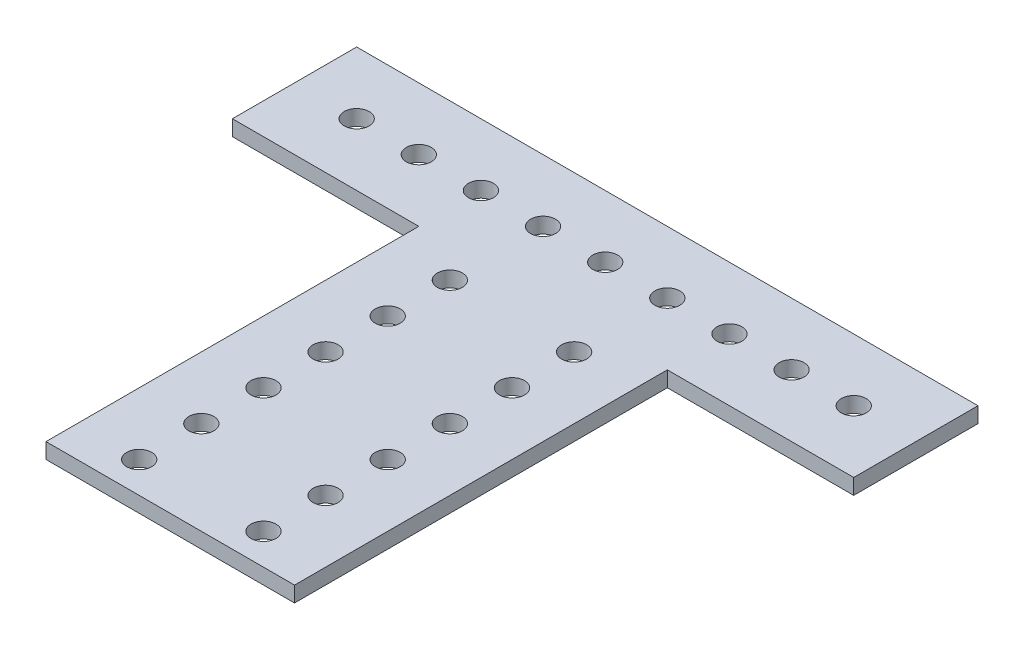
ISO-10303-21;
HEADER;
FILE_DESCRIPTION(('STEP AP214'),'2;1');
FILE_NAME('part.step','',(''),(''),'','','');
FILE_SCHEMA(('AUTOMOTIVE_DESIGN { 1 0 10303 214 1 1 1 1 }'));
ENDSEC;
DATA;
#1=APPLICATION_CONTEXT('core data for automotive mechanical design processes');
#2=APPLICATION_PROTOCOL_DEFINITION('international standard','automotive_design',2000,#1);
#3=PRODUCT_CONTEXT('',#1,'mechanical');
#4=PRODUCT('Part','Part','',(#3));
#5=PRODUCT_RELATED_PRODUCT_CATEGORY('part','',(#4));
#6=PRODUCT_DEFINITION_FORMATION('','',#4);
#7=PRODUCT_DEFINITION_CONTEXT('part definition',#1,'design');
#8=PRODUCT_DEFINITION('design','',#6,#7);
#9=PRODUCT_DEFINITION_SHAPE('','',#8);
#10=(LENGTH_UNIT() NAMED_UNIT(*) SI_UNIT(.MILLI.,.METRE.));
#11=(NAMED_UNIT(*) PLANE_ANGLE_UNIT() SI_UNIT($,.RADIAN.));
#12=(NAMED_UNIT(*) SI_UNIT($,.STERADIAN.) SOLID_ANGLE_UNIT());
#13=UNCERTAINTY_MEASURE_WITH_UNIT(LENGTH_MEASURE(1.E-05),#10,'distance_accuracy_value','');
#14=(GEOMETRIC_REPRESENTATION_CONTEXT(3) GLOBAL_UNCERTAINTY_ASSIGNED_CONTEXT((#13)) GLOBAL_UNIT_ASSIGNED_CONTEXT((#10,
#11,#12)) REPRESENTATION_CONTEXT('',''));
#15=CARTESIAN_POINT('',(0.,0.,0.));
#16=DIRECTION('',(0.,0.,1.));
#17=DIRECTION('',(1.,0.,0.));
#18=AXIS2_PLACEMENT_3D('',#15,#16,#17);
#19=CARTESIAN_POINT('',(0.,3.175,-76.2));
#20=DIRECTION('',(1.,0.,0.));
#21=DIRECTION('',(0.,0.,-1.));
#22=AXIS2_PLACEMENT_3D('',#19,#20,#21);
#23=PLANE('',#22);
#24=DIRECTION('',(0.,0.,1.));
#25=VECTOR('',#24,1.);
#26=CARTESIAN_POINT('',(0.,0.,-76.2));
#27=LINE('',#26,#25);
#28=CARTESIAN_POINT('',(0.,0.,-76.2));
#29=VERTEX_POINT('',#28);
#30=CARTESIAN_POINT('',(0.,0.,0.));
#31=VERTEX_POINT('',#30);
#32=EDGE_CURVE('E139',#29,#31,#27,.T.);
#33=ORIENTED_EDGE('',*,*,#32,.T.);
#34=DIRECTION('',(0.,-1.,0.));
#35=VECTOR('',#34,1.);
#36=CARTESIAN_POINT('',(0.,3.175,0.));
#37=LINE('',#36,#35);
#38=CARTESIAN_POINT('',(0.,3.175,0.));
#39=VERTEX_POINT('',#38);
#40=EDGE_CURVE('E11',#39,#31,#37,.T.);
#41=ORIENTED_EDGE('',*,*,#40,.F.);
#42=DIRECTION('',(0.,0.,1.));
#43=VECTOR('',#42,1.);
#44=CARTESIAN_POINT('',(0.,3.175,-76.2));
#45=LINE('',#44,#43);
#46=CARTESIAN_POINT('',(0.,3.175,-76.2));
#47=VERTEX_POINT('',#46);
#48=EDGE_CURVE('E162',#47,#39,#45,.T.);
#49=ORIENTED_EDGE('',*,*,#48,.F.);
#50=DIRECTION('',(0.,-1.,0.));
#51=VECTOR('',#50,1.);
#52=CARTESIAN_POINT('',(0.,3.175,-76.2));
#53=LINE('',#52,#51);
#54=EDGE_CURVE('E135',#47,#29,#53,.T.);
#55=ORIENTED_EDGE('',*,*,#54,.T.);
#56=EDGE_LOOP('',(#33,#41,#49,#55));
#57=FACE_BOUND('',#56,.T.);
#58=ADVANCED_FACE('F38',(#57),#23,.F.);
#59=CARTESIAN_POINT('',(0.,3.175,0.));
#60=DIRECTION('',(0.,0.,-1.));
#61=DIRECTION('',(-1.,0.,0.));
#62=AXIS2_PLACEMENT_3D('',#59,#60,#61);
#63=PLANE('',#62);
#64=DIRECTION('',(1.,0.,0.));
#65=VECTOR('',#64,1.);
#66=CARTESIAN_POINT('',(0.,0.,0.));
#67=LINE('',#66,#65);
#68=CARTESIAN_POINT('',(50.8,0.,0.));
#69=VERTEX_POINT('',#68);
#70=EDGE_CURVE('E143',#31,#69,#67,.T.);
#71=ORIENTED_EDGE('',*,*,#70,.T.);
#72=DIRECTION('',(0.,-1.,0.));
#73=VECTOR('',#72,1.);
#74=CARTESIAN_POINT('',(50.8,3.175,0.));
#75=LINE('',#74,#73);
#76=CARTESIAN_POINT('',(50.8,3.175,0.));
#77=VERTEX_POINT('',#76);
#78=EDGE_CURVE('E47',#77,#69,#75,.T.);
#79=ORIENTED_EDGE('',*,*,#78,.F.);
#80=DIRECTION('',(1.,0.,0.));
#81=VECTOR('',#80,1.);
#82=CARTESIAN_POINT('',(0.,3.175,0.));
#83=LINE('',#82,#81);
#84=EDGE_CURVE('E98',#39,#77,#83,.T.);
#85=ORIENTED_EDGE('',*,*,#84,.F.);
#86=ORIENTED_EDGE('',*,*,#40,.T.);
#87=EDGE_LOOP('',(#71,#79,#85,#86));
#88=FACE_BOUND('',#87,.T.);
#89=ADVANCED_FACE('F444',(#88),#63,.F.);
#90=CARTESIAN_POINT('',(50.8,3.175,0.));
#91=DIRECTION('',(-1.,0.,0.));
#92=DIRECTION('',(0.,0.,1.));
#93=AXIS2_PLACEMENT_3D('',#90,#91,#92);
#94=PLANE('',#93);
#95=DIRECTION('',(0.,0.,-1.));
#96=VECTOR('',#95,1.);
#97=CARTESIAN_POINT('',(50.8,0.,0.));
#98=LINE('',#97,#96);
#99=CARTESIAN_POINT('',(50.8,0.,-76.2));
#100=VERTEX_POINT('',#99);
#101=EDGE_CURVE('E147',#69,#100,#98,.T.);
#102=ORIENTED_EDGE('',*,*,#101,.T.);
#103=DIRECTION('',(0.,-1.,0.));
#104=VECTOR('',#103,1.);
#105=CARTESIAN_POINT('',(50.8,3.175,-76.2));
#106=LINE('',#105,#104);
#107=CARTESIAN_POINT('',(50.8,3.175,-76.2));
#108=VERTEX_POINT('',#107);
#109=EDGE_CURVE('E173',#108,#100,#106,.T.);
#110=ORIENTED_EDGE('',*,*,#109,.F.);
#111=DIRECTION('',(0.,0.,-1.));
#112=VECTOR('',#111,1.);
#113=CARTESIAN_POINT('',(50.8,3.175,0.));
#114=LINE('',#113,#112);
#115=EDGE_CURVE('E183',#77,#108,#114,.T.);
#116=ORIENTED_EDGE('',*,*,#115,.F.);
#117=ORIENTED_EDGE('',*,*,#78,.T.);
#118=EDGE_LOOP('',(#102,#110,#116,#117));
#119=FACE_BOUND('',#118,.T.);
#120=ADVANCED_FACE('F181',(#119),#94,.F.);
#121=CARTESIAN_POINT('',(50.8,3.175,-76.2));
#122=DIRECTION('',(0.,0.,-1.));
#123=DIRECTION('',(-1.,0.,0.));
#124=AXIS2_PLACEMENT_3D('',#121,#122,#123);
#125=PLANE('',#124);
#126=DIRECTION('',(1.,0.,0.));
#127=VECTOR('',#126,1.);
#128=CARTESIAN_POINT('',(50.8,0.,-76.2));
#129=LINE('',#128,#127);
#130=CARTESIAN_POINT('',(88.9,0.,-76.2));
#131=VERTEX_POINT('',#130);
#132=EDGE_CURVE('E150',#100,#131,#129,.T.);
#133=ORIENTED_EDGE('',*,*,#132,.T.);
#134=DIRECTION('',(0.,-1.,0.));
#135=VECTOR('',#134,1.);
#136=CARTESIAN_POINT('',(88.9,3.175,-76.2));
#137=LINE('',#136,#135);
#138=CARTESIAN_POINT('',(88.9,3.175,-76.2));
#139=VERTEX_POINT('',#138);
#140=EDGE_CURVE('E169',#139,#131,#137,.T.);
#141=ORIENTED_EDGE('',*,*,#140,.F.);
#142=DIRECTION('',(1.,0.,0.));
#143=VECTOR('',#142,1.);
#144=CARTESIAN_POINT('',(50.8,3.175,-76.2));
#145=LINE('',#144,#143);
#146=EDGE_CURVE('E196',#108,#139,#145,.T.);
#147=ORIENTED_EDGE('',*,*,#146,.F.);
#148=ORIENTED_EDGE('',*,*,#109,.T.);
#149=EDGE_LOOP('',(#133,#141,#147,#148));
#150=FACE_BOUND('',#149,.T.);
#151=ADVANCED_FACE('F191',(#150),#125,.F.);
#152=CARTESIAN_POINT('',(88.9,3.175,-76.2));
#153=DIRECTION('',(-1.,0.,0.));
#154=DIRECTION('',(0.,0.,1.));
#155=AXIS2_PLACEMENT_3D('',#152,#153,#154);
#156=PLANE('',#155);
#157=DIRECTION('',(0.,0.,-1.));
#158=VECTOR('',#157,1.);
#159=CARTESIAN_POINT('',(88.9,0.,-76.2));
#160=LINE('',#159,#158);
#161=CARTESIAN_POINT('',(88.9,0.,-101.6));
#162=VERTEX_POINT('',#161);
#163=EDGE_CURVE('E153',#131,#162,#160,.T.);
#164=ORIENTED_EDGE('',*,*,#163,.T.);
#165=DIRECTION('',(0.,-1.,0.));
#166=VECTOR('',#165,1.);
#167=CARTESIAN_POINT('',(88.9,3.175,-101.6));
#168=LINE('',#167,#166);
#169=CARTESIAN_POINT('',(88.9,3.175,-101.6));
#170=VERTEX_POINT('',#169);
#171=EDGE_CURVE('E128',#170,#162,#168,.T.);
#172=ORIENTED_EDGE('',*,*,#171,.F.);
#173=DIRECTION('',(0.,0.,-1.));
#174=VECTOR('',#173,1.);
#175=CARTESIAN_POINT('',(88.9,3.175,-76.2));
#176=LINE('',#175,#174);
#177=EDGE_CURVE('E117',#139,#170,#176,.T.);
#178=ORIENTED_EDGE('',*,*,#177,.F.);
#179=ORIENTED_EDGE('',*,*,#140,.T.);
#180=EDGE_LOOP('',(#164,#172,#178,#179));
#181=FACE_BOUND('',#180,.T.);
#182=ADVANCED_FACE('F194',(#181),#156,.F.);
#183=CARTESIAN_POINT('',(88.9,3.175,-101.6));
#184=DIRECTION('',(0.,0.,1.));
#185=DIRECTION('',(1.,0.,0.));
#186=AXIS2_PLACEMENT_3D('',#183,#184,#185);
#187=PLANE('',#186);
#188=DIRECTION('',(-1.,0.,0.));
#189=VECTOR('',#188,1.);
#190=CARTESIAN_POINT('',(88.9,0.,-101.6));
#191=LINE('',#190,#189);
#192=CARTESIAN_POINT('',(-38.1,0.,-101.6));
#193=VERTEX_POINT('',#192);
#194=EDGE_CURVE('E126',#162,#193,#191,.T.);
#195=ORIENTED_EDGE('',*,*,#194,.T.);
#196=DIRECTION('',(0.,-1.,0.));
#197=VECTOR('',#196,1.);
#198=CARTESIAN_POINT('',(-38.1,3.175,-101.6));
#199=LINE('',#198,#197);
#200=CARTESIAN_POINT('',(-38.1,3.175,-101.6));
#201=VERTEX_POINT('',#200);
#202=EDGE_CURVE('E123',#201,#193,#199,.T.);
#203=ORIENTED_EDGE('',*,*,#202,.F.);
#204=DIRECTION('',(-1.,0.,0.));
#205=VECTOR('',#204,1.);
#206=CARTESIAN_POINT('',(88.9,3.175,-101.6));
#207=LINE('',#206,#205);
#208=EDGE_CURVE('E111',#170,#201,#207,.T.);
#209=ORIENTED_EDGE('',*,*,#208,.F.);
#210=ORIENTED_EDGE('',*,*,#171,.T.);
#211=EDGE_LOOP('',(#195,#203,#209,#210));
#212=FACE_BOUND('',#211,.T.);
#213=ADVANCED_FACE('F124',(#212),#187,.F.);
#214=CARTESIAN_POINT('',(-38.1,3.175,-101.6));
#215=DIRECTION('',(1.,0.,0.));
#216=DIRECTION('',(0.,0.,-1.));
#217=AXIS2_PLACEMENT_3D('',#214,#215,#216);
#218=PLANE('',#217);
#219=DIRECTION('',(0.,0.,1.));
#220=VECTOR('',#219,1.);
#221=CARTESIAN_POINT('',(-38.1,0.,-101.6));
#222=LINE('',#221,#220);
#223=CARTESIAN_POINT('',(-38.1,0.,-76.2));
#224=VERTEX_POINT('',#223);
#225=EDGE_CURVE('E84',#193,#224,#222,.T.);
#226=ORIENTED_EDGE('',*,*,#225,.T.);
#227=DIRECTION('',(0.,-1.,0.));
#228=VECTOR('',#227,1.);
#229=CARTESIAN_POINT('',(-38.1,3.175,-76.2));
#230=LINE('',#229,#228);
#231=CARTESIAN_POINT('',(-38.1,3.175,-76.2));
#232=VERTEX_POINT('',#231);
#233=EDGE_CURVE('E129',#232,#224,#230,.T.);
#234=ORIENTED_EDGE('',*,*,#233,.F.);
#235=DIRECTION('',(0.,0.,1.));
#236=VECTOR('',#235,1.);
#237=CARTESIAN_POINT('',(-38.1,3.175,-101.6));
#238=LINE('',#237,#236);
#239=EDGE_CURVE('E115',#201,#232,#238,.T.);
#240=ORIENTED_EDGE('',*,*,#239,.F.);
#241=ORIENTED_EDGE('',*,*,#202,.T.);
#242=EDGE_LOOP('',(#226,#234,#240,#241));
#243=FACE_BOUND('',#242,.T.);
#244=ADVANCED_FACE('F131',(#243),#218,.F.);
#245=CARTESIAN_POINT('',(-38.1,3.175,-76.2));
#246=DIRECTION('',(0.,0.,-1.));
#247=DIRECTION('',(-1.,0.,0.));
#248=AXIS2_PLACEMENT_3D('',#245,#246,#247);
#249=PLANE('',#248);
#250=DIRECTION('',(1.,0.,0.));
#251=VECTOR('',#250,1.);
#252=CARTESIAN_POINT('',(-38.1,0.,-76.2));
#253=LINE('',#252,#251);
#254=EDGE_CURVE('E90',#224,#29,#253,.T.);
#255=ORIENTED_EDGE('',*,*,#254,.T.);
#256=ORIENTED_EDGE('',*,*,#54,.F.);
#257=DIRECTION('',(1.,0.,0.));
#258=VECTOR('',#257,1.);
#259=CARTESIAN_POINT('',(-38.1,3.175,-76.2));
#260=LINE('',#259,#258);
#261=EDGE_CURVE('E55',#232,#47,#260,.T.);
#262=ORIENTED_EDGE('',*,*,#261,.F.);
#263=ORIENTED_EDGE('',*,*,#233,.T.);
#264=EDGE_LOOP('',(#255,#256,#262,#263));
#265=FACE_BOUND('',#264,.T.);
#266=ADVANCED_FACE('F385',(#265),#249,.F.);
#267=CARTESIAN_POINT('',(0.,3.175,0.));
#268=DIRECTION('',(0.,1.,0.));
#269=DIRECTION('',(0.,0.,1.));
#270=AXIS2_PLACEMENT_3D('',#267,#268,#269);
#271=PLANE('',#270);
#272=CARTESIAN_POINT('',(76.2,3.175,-88.8999999999994));
#273=DIRECTION('',(0.,1.,0.));
#274=DIRECTION('',(0.,0.,1.));
#275=AXIS2_PLACEMENT_3D('',#272,#273,#274);
#276=CIRCLE('',#275,2.55270000000003);
#277=CARTESIAN_POINT('',(76.2,3.175,-86.3472999999993));
#278=VERTEX_POINT('',#277);
#279=EDGE_CURVE('E366',#278,#278,#276,.T.);
#280=ORIENTED_EDGE('',*,*,#279,.F.);
#281=EDGE_LOOP('',(#280));
#282=FACE_BOUND('',#281,.T.);
#283=CARTESIAN_POINT('',(63.5,3.175,-88.8999999999994));
#284=DIRECTION('',(0.,1.,0.));
#285=DIRECTION('',(0.,0.,1.));
#286=AXIS2_PLACEMENT_3D('',#283,#284,#285);
#287=CIRCLE('',#286,2.55270000000003);
#288=CARTESIAN_POINT('',(63.5,3.175,-86.3472999999993));
#289=VERTEX_POINT('',#288);
#290=EDGE_CURVE('E358',#289,#289,#287,.T.);
#291=ORIENTED_EDGE('',*,*,#290,.F.);
#292=EDGE_LOOP('',(#291));
#293=FACE_BOUND('',#292,.T.);
#294=CARTESIAN_POINT('',(50.8,3.175,-88.8999999999994));
#295=DIRECTION('',(0.,1.,0.));
#296=DIRECTION('',(0.,0.,1.));
#297=AXIS2_PLACEMENT_3D('',#294,#295,#296);
#298=CIRCLE('',#297,2.55270000000003);
#299=CARTESIAN_POINT('',(50.8,3.175,-86.3472999999993));
#300=VERTEX_POINT('',#299);
#301=EDGE_CURVE('E350',#300,#300,#298,.T.);
#302=ORIENTED_EDGE('',*,*,#301,.F.);
#303=EDGE_LOOP('',(#302));
#304=FACE_BOUND('',#303,.T.);
#305=CARTESIAN_POINT('',(38.1,3.175,-88.8999999999994));
#306=DIRECTION('',(0.,1.,0.));
#307=DIRECTION('',(0.,0.,1.));
#308=AXIS2_PLACEMENT_3D('',#305,#306,#307);
#309=CIRCLE('',#308,2.55270000000003);
#310=CARTESIAN_POINT('',(38.1,3.175,-86.3472999999993));
#311=VERTEX_POINT('',#310);
#312=EDGE_CURVE('E342',#311,#311,#309,.T.);
#313=ORIENTED_EDGE('',*,*,#312,.F.);
#314=EDGE_LOOP('',(#313));
#315=FACE_BOUND('',#314,.T.);
#316=CARTESIAN_POINT('',(25.4,3.175,-88.8999999999994));
#317=DIRECTION('',(0.,1.,0.));
#318=DIRECTION('',(0.,0.,1.));
#319=AXIS2_PLACEMENT_3D('',#316,#317,#318);
#320=CIRCLE('',#319,2.55270000000003);
#321=CARTESIAN_POINT('',(25.4,3.175,-86.3472999999993));
#322=VERTEX_POINT('',#321);
#323=EDGE_CURVE('E334',#322,#322,#320,.T.);
#324=ORIENTED_EDGE('',*,*,#323,.F.);
#325=EDGE_LOOP('',(#324));
#326=FACE_BOUND('',#325,.T.);
#327=CARTESIAN_POINT('',(12.7,3.175,-88.8999999999994));
#328=DIRECTION('',(0.,1.,0.));
#329=DIRECTION('',(0.,0.,1.));
#330=AXIS2_PLACEMENT_3D('',#327,#328,#329);
#331=CIRCLE('',#330,2.55270000000003);
#332=CARTESIAN_POINT('',(12.7,3.175,-86.3472999999993));
#333=VERTEX_POINT('',#332);
#334=EDGE_CURVE('E326',#333,#333,#331,.T.);
#335=ORIENTED_EDGE('',*,*,#334,.F.);
#336=EDGE_LOOP('',(#335));
#337=FACE_BOUND('',#336,.T.);
#338=CARTESIAN_POINT('',(0.,3.175,-88.8999999999994));
#339=DIRECTION('',(0.,1.,0.));
#340=DIRECTION('',(0.,0.,1.));
#341=AXIS2_PLACEMENT_3D('',#338,#339,#340);
#342=CIRCLE('',#341,2.55270000000003);
#343=CARTESIAN_POINT('',(0.,3.175,-86.3472999999993));
#344=VERTEX_POINT('',#343);
#345=EDGE_CURVE('E318',#344,#344,#342,.T.);
#346=ORIENTED_EDGE('',*,*,#345,.F.);
#347=EDGE_LOOP('',(#346));
#348=FACE_BOUND('',#347,.T.);
#349=CARTESIAN_POINT('',(-12.7,3.175,-88.8999999999994));
#350=DIRECTION('',(0.,1.,0.));
#351=DIRECTION('',(0.,0.,1.));
#352=AXIS2_PLACEMENT_3D('',#349,#350,#351);
#353=CIRCLE('',#352,2.55270000000003);
#354=CARTESIAN_POINT('',(-12.7,3.175,-86.3472999999993));
#355=VERTEX_POINT('',#354);
#356=EDGE_CURVE('E310',#355,#355,#353,.T.);
#357=ORIENTED_EDGE('',*,*,#356,.F.);
#358=EDGE_LOOP('',(#357));
#359=FACE_BOUND('',#358,.T.);
#360=CARTESIAN_POINT('',(-25.4,3.175,-88.8999999999994));
#361=DIRECTION('',(0.,1.,0.));
#362=DIRECTION('',(0.,0.,1.));
#363=AXIS2_PLACEMENT_3D('',#360,#361,#362);
#364=CIRCLE('',#363,2.55270000000003);
#365=CARTESIAN_POINT('',(-25.4,3.175,-86.3472999999993));
#366=VERTEX_POINT('',#365);
#367=EDGE_CURVE('E302',#366,#366,#364,.T.);
#368=ORIENTED_EDGE('',*,*,#367,.F.);
#369=EDGE_LOOP('',(#368));
#370=FACE_BOUND('',#369,.T.);
#371=CARTESIAN_POINT('',(12.7,3.175,-31.75));
#372=DIRECTION('',(0.,1.,0.));
#373=DIRECTION('',(0.,0.,1.));
#374=AXIS2_PLACEMENT_3D('',#371,#372,#373);
#375=CIRCLE('',#374,2.5527);
#376=CARTESIAN_POINT('',(12.7,3.175,-29.1973));
#377=VERTEX_POINT('',#376);
#378=EDGE_CURVE('E255',#377,#377,#375,.T.);
#379=ORIENTED_EDGE('',*,*,#378,.F.);
#380=EDGE_LOOP('',(#379));
#381=FACE_BOUND('',#380,.T.);
#382=CARTESIAN_POINT('',(38.1,3.175,-44.45));
#383=DIRECTION('',(0.,1.,0.));
#384=DIRECTION('',(0.,0.,1.));
#385=AXIS2_PLACEMENT_3D('',#382,#383,#384);
#386=CIRCLE('',#385,2.5527);
#387=CARTESIAN_POINT('',(38.1,3.175,-41.8973));
#388=VERTEX_POINT('',#387);
#389=EDGE_CURVE('E246',#388,#388,#386,.T.);
#390=ORIENTED_EDGE('',*,*,#389,.F.);
#391=EDGE_LOOP('',(#390));
#392=FACE_BOUND('',#391,.T.);
#393=CARTESIAN_POINT('',(12.7,3.175,-44.45));
#394=DIRECTION('',(0.,1.,0.));
#395=DIRECTION('',(0.,0.,1.));
#396=AXIS2_PLACEMENT_3D('',#393,#394,#395);
#397=CIRCLE('',#396,2.5527);
#398=CARTESIAN_POINT('',(12.7,3.175,-41.8973));
#399=VERTEX_POINT('',#398);
#400=EDGE_CURVE('E271',#399,#399,#397,.T.);
#401=ORIENTED_EDGE('',*,*,#400,.F.);
#402=EDGE_LOOP('',(#401));
#403=FACE_BOUND('',#402,.T.);
#404=CARTESIAN_POINT('',(38.1,3.175,-57.15));
#405=DIRECTION('',(0.,1.,0.));
#406=DIRECTION('',(0.,0.,1.));
#407=AXIS2_PLACEMENT_3D('',#404,#405,#406);
#408=CIRCLE('',#407,2.5527);
#409=CARTESIAN_POINT('',(38.1,3.175,-54.5973));
#410=VERTEX_POINT('',#409);
#411=EDGE_CURVE('E262',#410,#410,#408,.T.);
#412=ORIENTED_EDGE('',*,*,#411,.F.);
#413=EDGE_LOOP('',(#412));
#414=FACE_BOUND('',#413,.T.);
#415=CARTESIAN_POINT('',(12.7,3.175,-6.34999999999999));
#416=DIRECTION('',(0.,1.,0.));
#417=DIRECTION('',(0.,0.,1.));
#418=AXIS2_PLACEMENT_3D('',#415,#416,#417);
#419=CIRCLE('',#418,2.5527);
#420=CARTESIAN_POINT('',(12.7,3.175,-3.79729999999999));
#421=VERTEX_POINT('',#420);
#422=EDGE_CURVE('E223',#421,#421,#419,.T.);
#423=ORIENTED_EDGE('',*,*,#422,.F.);
#424=EDGE_LOOP('',(#423));
#425=FACE_BOUND('',#424,.T.);
#426=CARTESIAN_POINT('',(38.1,3.175,-19.05));
#427=DIRECTION('',(0.,1.,0.));
#428=DIRECTION('',(0.,0.,1.));
#429=AXIS2_PLACEMENT_3D('',#426,#427,#428);
#430=CIRCLE('',#429,2.5527);
#431=CARTESIAN_POINT('',(38.1,3.175,-16.4973));
#432=VERTEX_POINT('',#431);
#433=EDGE_CURVE('E214',#432,#432,#430,.T.);
#434=ORIENTED_EDGE('',*,*,#433,.F.);
#435=EDGE_LOOP('',(#434));
#436=FACE_BOUND('',#435,.T.);
#437=CARTESIAN_POINT('',(12.7,3.175,-19.05));
#438=DIRECTION('',(0.,1.,0.));
#439=DIRECTION('',(0.,0.,1.));
#440=AXIS2_PLACEMENT_3D('',#437,#438,#439);
#441=CIRCLE('',#440,2.5527);
#442=CARTESIAN_POINT('',(12.7,3.175,-16.4973));
#443=VERTEX_POINT('',#442);
#444=EDGE_CURVE('E239',#443,#443,#441,.T.);
#445=ORIENTED_EDGE('',*,*,#444,.F.);
#446=EDGE_LOOP('',(#445));
#447=FACE_BOUND('',#446,.T.);
#448=CARTESIAN_POINT('',(38.1,3.175,-31.75));
#449=DIRECTION('',(0.,1.,0.));
#450=DIRECTION('',(0.,0.,1.));
#451=AXIS2_PLACEMENT_3D('',#448,#449,#450);
#452=CIRCLE('',#451,2.5527);
#453=CARTESIAN_POINT('',(38.1,3.175,-29.1973));
#454=VERTEX_POINT('',#453);
#455=EDGE_CURVE('E230',#454,#454,#452,.T.);
#456=ORIENTED_EDGE('',*,*,#455,.F.);
#457=EDGE_LOOP('',(#456));
#458=FACE_BOUND('',#457,.T.);
#459=CARTESIAN_POINT('',(12.7,3.175,-69.85));
#460=DIRECTION('',(0.,1.,0.));
#461=DIRECTION('',(0.,0.,1.));
#462=AXIS2_PLACEMENT_3D('',#459,#460,#461);
#463=CIRCLE('',#462,2.5527);
#464=CARTESIAN_POINT('',(12.7,3.175,-67.2973));
#465=VERTEX_POINT('',#464);
#466=EDGE_CURVE('E294',#465,#465,#463,.T.);
#467=ORIENTED_EDGE('',*,*,#466,.F.);
#468=EDGE_LOOP('',(#467));
#469=FACE_BOUND('',#468,.T.);
#470=CARTESIAN_POINT('',(38.1,3.175,-69.85));
#471=DIRECTION('',(0.,1.,0.));
#472=DIRECTION('',(0.,0.,1.));
#473=AXIS2_PLACEMENT_3D('',#470,#471,#472);
#474=CIRCLE('',#473,2.5527);
#475=CARTESIAN_POINT('',(38.1,3.175,-67.2973));
#476=VERTEX_POINT('',#475);
#477=EDGE_CURVE('E278',#476,#476,#474,.T.);
#478=ORIENTED_EDGE('',*,*,#477,.F.);
#479=EDGE_LOOP('',(#478));
#480=FACE_BOUND('',#479,.T.);
#481=CARTESIAN_POINT('',(12.7,3.175,-57.15));
#482=DIRECTION('',(0.,1.,0.));
#483=DIRECTION('',(0.,0.,1.));
#484=AXIS2_PLACEMENT_3D('',#481,#482,#483);
#485=CIRCLE('',#484,2.5527);
#486=CARTESIAN_POINT('',(12.7,3.175,-54.5973));
#487=VERTEX_POINT('',#486);
#488=EDGE_CURVE('E287',#487,#487,#485,.T.);
#489=ORIENTED_EDGE('',*,*,#488,.F.);
#490=EDGE_LOOP('',(#489));
#491=FACE_BOUND('',#490,.T.);
#492=CARTESIAN_POINT('',(38.1,3.175,-6.35));
#493=DIRECTION('',(0.,1.,0.));
#494=DIRECTION('',(0.,0.,1.));
#495=AXIS2_PLACEMENT_3D('',#492,#493,#494);
#496=CIRCLE('',#495,2.5527);
#497=CARTESIAN_POINT('',(38.1,3.175,-3.7973));
#498=VERTEX_POINT('',#497);
#499=EDGE_CURVE('E206',#498,#498,#496,.T.);
#500=ORIENTED_EDGE('',*,*,#499,.F.);
#501=EDGE_LOOP('',(#500));
#502=FACE_BOUND('',#501,.T.);
#503=ORIENTED_EDGE('',*,*,#48,.T.);
#504=ORIENTED_EDGE('',*,*,#84,.T.);
#505=ORIENTED_EDGE('',*,*,#115,.T.);
#506=ORIENTED_EDGE('',*,*,#146,.T.);
#507=ORIENTED_EDGE('',*,*,#177,.T.);
#508=ORIENTED_EDGE('',*,*,#208,.T.);
#509=ORIENTED_EDGE('',*,*,#239,.T.);
#510=ORIENTED_EDGE('',*,*,#261,.T.);
#511=EDGE_LOOP('',(#503,#504,#505,#506,#507,#508,#509,#510));
#512=FACE_BOUND('',#511,.T.);
#513=ADVANCED_FACE('F113',(#282,#293,#304,#315,#326,#337,#348,#359,#370,#381,#392,#403,#414,
#425,#436,#447,#458,#469,#480,#491,#502,#512),#271,.T.);
#514=CARTESIAN_POINT('',(0.,0.,0.));
#515=DIRECTION('',(0.,1.,0.));
#516=DIRECTION('',(0.,0.,1.));
#517=AXIS2_PLACEMENT_3D('',#514,#515,#516);
#518=PLANE('',#517);
#519=CARTESIAN_POINT('',(76.2,0.,-88.8999999999994));
#520=DIRECTION('',(0.,1.,0.));
#521=DIRECTION('',(0.,0.,1.));
#522=AXIS2_PLACEMENT_3D('',#519,#520,#521);
#523=CIRCLE('',#522,2.55270000000003);
#524=CARTESIAN_POINT('',(76.2,0.,-86.3472999999993));
#525=VERTEX_POINT('',#524);
#526=EDGE_CURVE('E298',#525,#525,#523,.T.);
#527=ORIENTED_EDGE('',*,*,#526,.T.);
#528=EDGE_LOOP('',(#527));
#529=FACE_BOUND('',#528,.T.);
#530=CARTESIAN_POINT('',(63.5,0.,-88.8999999999994));
#531=DIRECTION('',(0.,1.,0.));
#532=DIRECTION('',(0.,0.,1.));
#533=AXIS2_PLACEMENT_3D('',#530,#531,#532);
#534=CIRCLE('',#533,2.55270000000003);
#535=CARTESIAN_POINT('',(63.5,0.,-86.3472999999993));
#536=VERTEX_POINT('',#535);
#537=EDGE_CURVE('E362',#536,#536,#534,.T.);
#538=ORIENTED_EDGE('',*,*,#537,.T.);
#539=EDGE_LOOP('',(#538));
#540=FACE_BOUND('',#539,.T.);
#541=CARTESIAN_POINT('',(50.8,0.,-88.8999999999994));
#542=DIRECTION('',(0.,1.,0.));
#543=DIRECTION('',(0.,0.,1.));
#544=AXIS2_PLACEMENT_3D('',#541,#542,#543);
#545=CIRCLE('',#544,2.55270000000003);
#546=CARTESIAN_POINT('',(50.8,0.,-86.3472999999993));
#547=VERTEX_POINT('',#546);
#548=EDGE_CURVE('E354',#547,#547,#545,.T.);
#549=ORIENTED_EDGE('',*,*,#548,.T.);
#550=EDGE_LOOP('',(#549));
#551=FACE_BOUND('',#550,.T.);
#552=CARTESIAN_POINT('',(38.1,0.,-88.8999999999994));
#553=DIRECTION('',(0.,1.,0.));
#554=DIRECTION('',(0.,0.,1.));
#555=AXIS2_PLACEMENT_3D('',#552,#553,#554);
#556=CIRCLE('',#555,2.55270000000003);
#557=CARTESIAN_POINT('',(38.1,0.,-86.3472999999993));
#558=VERTEX_POINT('',#557);
#559=EDGE_CURVE('E346',#558,#558,#556,.T.);
#560=ORIENTED_EDGE('',*,*,#559,.T.);
#561=EDGE_LOOP('',(#560));
#562=FACE_BOUND('',#561,.T.);
#563=CARTESIAN_POINT('',(25.4,0.,-88.8999999999994));
#564=DIRECTION('',(0.,1.,0.));
#565=DIRECTION('',(0.,0.,1.));
#566=AXIS2_PLACEMENT_3D('',#563,#564,#565);
#567=CIRCLE('',#566,2.55270000000003);
#568=CARTESIAN_POINT('',(25.4,0.,-86.3472999999993));
#569=VERTEX_POINT('',#568);
#570=EDGE_CURVE('E338',#569,#569,#567,.T.);
#571=ORIENTED_EDGE('',*,*,#570,.T.);
#572=EDGE_LOOP('',(#571));
#573=FACE_BOUND('',#572,.T.);
#574=CARTESIAN_POINT('',(12.7,0.,-88.8999999999994));
#575=DIRECTION('',(0.,1.,0.));
#576=DIRECTION('',(0.,0.,1.));
#577=AXIS2_PLACEMENT_3D('',#574,#575,#576);
#578=CIRCLE('',#577,2.55270000000003);
#579=CARTESIAN_POINT('',(12.7,0.,-86.3472999999993));
#580=VERTEX_POINT('',#579);
#581=EDGE_CURVE('E330',#580,#580,#578,.T.);
#582=ORIENTED_EDGE('',*,*,#581,.T.);
#583=EDGE_LOOP('',(#582));
#584=FACE_BOUND('',#583,.T.);
#585=CARTESIAN_POINT('',(0.,0.,-88.8999999999994));
#586=DIRECTION('',(0.,1.,0.));
#587=DIRECTION('',(0.,0.,1.));
#588=AXIS2_PLACEMENT_3D('',#585,#586,#587);
#589=CIRCLE('',#588,2.55270000000003);
#590=CARTESIAN_POINT('',(0.,0.,-86.3472999999993));
#591=VERTEX_POINT('',#590);
#592=EDGE_CURVE('E322',#591,#591,#589,.T.);
#593=ORIENTED_EDGE('',*,*,#592,.T.);
#594=EDGE_LOOP('',(#593));
#595=FACE_BOUND('',#594,.T.);
#596=CARTESIAN_POINT('',(-12.7,0.,-88.8999999999994));
#597=DIRECTION('',(0.,1.,0.));
#598=DIRECTION('',(0.,0.,1.));
#599=AXIS2_PLACEMENT_3D('',#596,#597,#598);
#600=CIRCLE('',#599,2.55270000000003);
#601=CARTESIAN_POINT('',(-12.7,0.,-86.3472999999993));
#602=VERTEX_POINT('',#601);
#603=EDGE_CURVE('E314',#602,#602,#600,.T.);
#604=ORIENTED_EDGE('',*,*,#603,.T.);
#605=EDGE_LOOP('',(#604));
#606=FACE_BOUND('',#605,.T.);
#607=CARTESIAN_POINT('',(-25.4,0.,-88.8999999999994));
#608=DIRECTION('',(0.,1.,0.));
#609=DIRECTION('',(0.,0.,1.));
#610=AXIS2_PLACEMENT_3D('',#607,#608,#609);
#611=CIRCLE('',#610,2.55270000000003);
#612=CARTESIAN_POINT('',(-25.4,0.,-86.3472999999993));
#613=VERTEX_POINT('',#612);
#614=EDGE_CURVE('E306',#613,#613,#611,.T.);
#615=ORIENTED_EDGE('',*,*,#614,.T.);
#616=EDGE_LOOP('',(#615));
#617=FACE_BOUND('',#616,.T.);
#618=CARTESIAN_POINT('',(12.7,0.,-31.75));
#619=DIRECTION('',(0.,1.,0.));
#620=DIRECTION('',(0.,0.,1.));
#621=AXIS2_PLACEMENT_3D('',#618,#619,#620);
#622=CIRCLE('',#621,2.5527);
#623=CARTESIAN_POINT('',(12.7,0.,-29.1973));
#624=VERTEX_POINT('',#623);
#625=EDGE_CURVE('E235',#624,#624,#622,.T.);
#626=ORIENTED_EDGE('',*,*,#625,.T.);
#627=EDGE_LOOP('',(#626));
#628=FACE_BOUND('',#627,.T.);
#629=CARTESIAN_POINT('',(38.1,0.,-44.45));
#630=DIRECTION('',(0.,1.,0.));
#631=DIRECTION('',(0.,0.,1.));
#632=AXIS2_PLACEMENT_3D('',#629,#630,#631);
#633=CIRCLE('',#632,2.5527);
#634=CARTESIAN_POINT('',(38.1,0.,-41.8973));
#635=VERTEX_POINT('',#634);
#636=EDGE_CURVE('E250',#635,#635,#633,.T.);
#637=ORIENTED_EDGE('',*,*,#636,.T.);
#638=EDGE_LOOP('',(#637));
#639=FACE_BOUND('',#638,.T.);
#640=CARTESIAN_POINT('',(12.7,0.,-44.45));
#641=DIRECTION('',(0.,1.,0.));
#642=DIRECTION('',(0.,0.,1.));
#643=AXIS2_PLACEMENT_3D('',#640,#641,#642);
#644=CIRCLE('',#643,2.5527);
#645=CARTESIAN_POINT('',(12.7,0.,-41.8973));
#646=VERTEX_POINT('',#645);
#647=EDGE_CURVE('E251',#646,#646,#644,.T.);
#648=ORIENTED_EDGE('',*,*,#647,.T.);
#649=EDGE_LOOP('',(#648));
#650=FACE_BOUND('',#649,.T.);
#651=CARTESIAN_POINT('',(38.1,0.,-57.15));
#652=DIRECTION('',(0.,1.,0.));
#653=DIRECTION('',(0.,0.,1.));
#654=AXIS2_PLACEMENT_3D('',#651,#652,#653);
#655=CIRCLE('',#654,2.5527);
#656=CARTESIAN_POINT('',(38.1,0.,-54.5973));
#657=VERTEX_POINT('',#656);
#658=EDGE_CURVE('E266',#657,#657,#655,.T.);
#659=ORIENTED_EDGE('',*,*,#658,.T.);
#660=EDGE_LOOP('',(#659));
#661=FACE_BOUND('',#660,.T.);
#662=CARTESIAN_POINT('',(12.7,0.,-6.34999999999999));
#663=DIRECTION('',(0.,1.,0.));
#664=DIRECTION('',(0.,0.,1.));
#665=AXIS2_PLACEMENT_3D('',#662,#663,#664);
#666=CIRCLE('',#665,2.5527);
#667=CARTESIAN_POINT('',(12.7,0.,-3.79729999999999));
#668=VERTEX_POINT('',#667);
#669=EDGE_CURVE('E210',#668,#668,#666,.T.);
#670=ORIENTED_EDGE('',*,*,#669,.T.);
#671=EDGE_LOOP('',(#670));
#672=FACE_BOUND('',#671,.T.);
#673=CARTESIAN_POINT('',(38.1,0.,-19.05));
#674=DIRECTION('',(0.,1.,0.));
#675=DIRECTION('',(0.,0.,1.));
#676=AXIS2_PLACEMENT_3D('',#673,#674,#675);
#677=CIRCLE('',#676,2.5527);
#678=CARTESIAN_POINT('',(38.1,0.,-16.4973));
#679=VERTEX_POINT('',#678);
#680=EDGE_CURVE('E218',#679,#679,#677,.T.);
#681=ORIENTED_EDGE('',*,*,#680,.T.);
#682=EDGE_LOOP('',(#681));
#683=FACE_BOUND('',#682,.T.);
#684=CARTESIAN_POINT('',(12.7,0.,-19.05));
#685=DIRECTION('',(0.,1.,0.));
#686=DIRECTION('',(0.,0.,1.));
#687=AXIS2_PLACEMENT_3D('',#684,#685,#686);
#688=CIRCLE('',#687,2.5527);
#689=CARTESIAN_POINT('',(12.7,0.,-16.4973));
#690=VERTEX_POINT('',#689);
#691=EDGE_CURVE('E219',#690,#690,#688,.T.);
#692=ORIENTED_EDGE('',*,*,#691,.T.);
#693=EDGE_LOOP('',(#692));
#694=FACE_BOUND('',#693,.T.);
#695=CARTESIAN_POINT('',(38.1,0.,-31.75));
#696=DIRECTION('',(0.,1.,0.));
#697=DIRECTION('',(0.,0.,1.));
#698=AXIS2_PLACEMENT_3D('',#695,#696,#697);
#699=CIRCLE('',#698,2.5527);
#700=CARTESIAN_POINT('',(38.1,0.,-29.1973));
#701=VERTEX_POINT('',#700);
#702=EDGE_CURVE('E234',#701,#701,#699,.T.);
#703=ORIENTED_EDGE('',*,*,#702,.T.);
#704=EDGE_LOOP('',(#703));
#705=FACE_BOUND('',#704,.T.);
#706=CARTESIAN_POINT('',(12.7,0.,-69.85));
#707=DIRECTION('',(0.,1.,0.));
#708=DIRECTION('',(0.,0.,1.));
#709=AXIS2_PLACEMENT_3D('',#706,#707,#708);
#710=CIRCLE('',#709,2.5527);
#711=CARTESIAN_POINT('',(12.7,0.,-67.2973));
#712=VERTEX_POINT('',#711);
#713=EDGE_CURVE('E283',#712,#712,#710,.T.);
#714=ORIENTED_EDGE('',*,*,#713,.T.);
#715=EDGE_LOOP('',(#714));
#716=FACE_BOUND('',#715,.T.);
#717=CARTESIAN_POINT('',(38.1,0.,-69.85));
#718=DIRECTION('',(0.,1.,0.));
#719=DIRECTION('',(0.,0.,1.));
#720=AXIS2_PLACEMENT_3D('',#717,#718,#719);
#721=CIRCLE('',#720,2.5527);
#722=CARTESIAN_POINT('',(38.1,0.,-67.2973));
#723=VERTEX_POINT('',#722);
#724=EDGE_CURVE('E282',#723,#723,#721,.T.);
#725=ORIENTED_EDGE('',*,*,#724,.T.);
#726=EDGE_LOOP('',(#725));
#727=FACE_BOUND('',#726,.T.);
#728=CARTESIAN_POINT('',(12.7,0.,-57.15));
#729=DIRECTION('',(0.,1.,0.));
#730=DIRECTION('',(0.,0.,1.));
#731=AXIS2_PLACEMENT_3D('',#728,#729,#730);
#732=CIRCLE('',#731,2.5527);
#733=CARTESIAN_POINT('',(12.7,0.,-54.5973));
#734=VERTEX_POINT('',#733);
#735=EDGE_CURVE('E267',#734,#734,#732,.T.);
#736=ORIENTED_EDGE('',*,*,#735,.T.);
#737=EDGE_LOOP('',(#736));
#738=FACE_BOUND('',#737,.T.);
#739=CARTESIAN_POINT('',(38.1,0.,-6.35));
#740=DIRECTION('',(0.,1.,0.));
#741=DIRECTION('',(0.,0.,1.));
#742=AXIS2_PLACEMENT_3D('',#739,#740,#741);
#743=CIRCLE('',#742,2.5527);
#744=CARTESIAN_POINT('',(38.1,0.,-3.7973));
#745=VERTEX_POINT('',#744);
#746=EDGE_CURVE('E144',#745,#745,#743,.T.);
#747=ORIENTED_EDGE('',*,*,#746,.T.);
#748=EDGE_LOOP('',(#747));
#749=FACE_BOUND('',#748,.T.);
#750=ORIENTED_EDGE('',*,*,#32,.F.);
#751=ORIENTED_EDGE('',*,*,#254,.F.);
#752=ORIENTED_EDGE('',*,*,#225,.F.);
#753=ORIENTED_EDGE('',*,*,#194,.F.);
#754=ORIENTED_EDGE('',*,*,#163,.F.);
#755=ORIENTED_EDGE('',*,*,#132,.F.);
#756=ORIENTED_EDGE('',*,*,#101,.F.);
#757=ORIENTED_EDGE('',*,*,#70,.F.);
#758=EDGE_LOOP('',(#750,#751,#752,#753,#754,#755,#756,#757));
#759=FACE_BOUND('',#758,.T.);
#760=ADVANCED_FACE('F187',(#529,#540,#551,#562,#573,#584,#595,#606,#617,#628,#639,#650,#661,
#672,#683,#694,#705,#716,#727,#738,#749,#759),#518,.F.);
#761=CARTESIAN_POINT('',(38.1,0.,-6.35));
#762=DIRECTION('',(0.,1.,0.));
#763=DIRECTION('',(0.,0.,1.));
#764=AXIS2_PLACEMENT_3D('',#761,#762,#763);
#765=CYLINDRICAL_SURFACE('',#764,2.5527);
#766=ORIENTED_EDGE('',*,*,#746,.F.);
#767=EDGE_LOOP('',(#766));
#768=FACE_BOUND('',#767,.T.);
#769=ORIENTED_EDGE('',*,*,#499,.T.);
#770=EDGE_LOOP('',(#769));
#771=FACE_BOUND('',#770,.T.);
#772=ADVANCED_FACE('F427',(#768,#771),#765,.F.);
#773=CARTESIAN_POINT('',(12.7,0.,-57.15));
#774=DIRECTION('',(0.,1.,0.));
#775=DIRECTION('',(0.,0.,1.));
#776=AXIS2_PLACEMENT_3D('',#773,#774,#775);
#777=CYLINDRICAL_SURFACE('',#776,2.5527);
#778=ORIENTED_EDGE('',*,*,#735,.F.);
#779=EDGE_LOOP('',(#778));
#780=FACE_BOUND('',#779,.T.);
#781=ORIENTED_EDGE('',*,*,#488,.T.);
#782=EDGE_LOOP('',(#781));
#783=FACE_BOUND('',#782,.T.);
#784=ADVANCED_FACE('F429',(#780,#783),#777,.F.);
#785=CARTESIAN_POINT('',(38.1,0.,-69.85));
#786=DIRECTION('',(0.,1.,0.));
#787=DIRECTION('',(0.,0.,1.));
#788=AXIS2_PLACEMENT_3D('',#785,#786,#787);
#789=CYLINDRICAL_SURFACE('',#788,2.5527);
#790=ORIENTED_EDGE('',*,*,#724,.F.);
#791=EDGE_LOOP('',(#790));
#792=FACE_BOUND('',#791,.T.);
#793=ORIENTED_EDGE('',*,*,#477,.T.);
#794=EDGE_LOOP('',(#793));
#795=FACE_BOUND('',#794,.T.);
#796=ADVANCED_FACE('F436',(#792,#795),#789,.F.);
#797=CARTESIAN_POINT('',(12.7,0.,-69.85));
#798=DIRECTION('',(0.,1.,0.));
#799=DIRECTION('',(0.,0.,1.));
#800=AXIS2_PLACEMENT_3D('',#797,#798,#799);
#801=CYLINDRICAL_SURFACE('',#800,2.5527);
#802=ORIENTED_EDGE('',*,*,#713,.F.);
#803=EDGE_LOOP('',(#802));
#804=FACE_BOUND('',#803,.T.);
#805=ORIENTED_EDGE('',*,*,#466,.T.);
#806=EDGE_LOOP('',(#805));
#807=FACE_BOUND('',#806,.T.);
#808=ADVANCED_FACE('F511',(#804,#807),#801,.F.);
#809=CARTESIAN_POINT('',(38.1,0.,-31.75));
#810=DIRECTION('',(0.,1.,0.));
#811=DIRECTION('',(0.,0.,1.));
#812=AXIS2_PLACEMENT_3D('',#809,#810,#811);
#813=CYLINDRICAL_SURFACE('',#812,2.5527);
#814=ORIENTED_EDGE('',*,*,#702,.F.);
#815=EDGE_LOOP('',(#814));
#816=FACE_BOUND('',#815,.T.);
#817=ORIENTED_EDGE('',*,*,#455,.T.);
#818=EDGE_LOOP('',(#817));
#819=FACE_BOUND('',#818,.T.);
#820=ADVANCED_FACE('F521',(#816,#819),#813,.F.);
#821=CARTESIAN_POINT('',(12.7,0.,-19.05));
#822=DIRECTION('',(0.,1.,0.));
#823=DIRECTION('',(0.,0.,1.));
#824=AXIS2_PLACEMENT_3D('',#821,#822,#823);
#825=CYLINDRICAL_SURFACE('',#824,2.5527);
#826=ORIENTED_EDGE('',*,*,#691,.F.);
#827=EDGE_LOOP('',(#826));
#828=FACE_BOUND('',#827,.T.);
#829=ORIENTED_EDGE('',*,*,#444,.T.);
#830=EDGE_LOOP('',(#829));
#831=FACE_BOUND('',#830,.T.);
#832=ADVANCED_FACE('F531',(#828,#831),#825,.F.);
#833=CARTESIAN_POINT('',(38.1,0.,-19.05));
#834=DIRECTION('',(0.,1.,0.));
#835=DIRECTION('',(0.,0.,1.));
#836=AXIS2_PLACEMENT_3D('',#833,#834,#835);
#837=CYLINDRICAL_SURFACE('',#836,2.5527);
#838=ORIENTED_EDGE('',*,*,#680,.F.);
#839=EDGE_LOOP('',(#838));
#840=FACE_BOUND('',#839,.T.);
#841=ORIENTED_EDGE('',*,*,#433,.T.);
#842=EDGE_LOOP('',(#841));
#843=FACE_BOUND('',#842,.T.);
#844=ADVANCED_FACE('F541',(#840,#843),#837,.F.);
#845=CARTESIAN_POINT('',(12.7,0.,-6.34999999999999));
#846=DIRECTION('',(0.,1.,0.));
#847=DIRECTION('',(0.,0.,1.));
#848=AXIS2_PLACEMENT_3D('',#845,#846,#847);
#849=CYLINDRICAL_SURFACE('',#848,2.5527);
#850=ORIENTED_EDGE('',*,*,#669,.F.);
#851=EDGE_LOOP('',(#850));
#852=FACE_BOUND('',#851,.T.);
#853=ORIENTED_EDGE('',*,*,#422,.T.);
#854=EDGE_LOOP('',(#853));
#855=FACE_BOUND('',#854,.T.);
#856=ADVANCED_FACE('F551',(#852,#855),#849,.F.);
#857=CARTESIAN_POINT('',(38.1,0.,-57.15));
#858=DIRECTION('',(0.,1.,0.));
#859=DIRECTION('',(0.,0.,1.));
#860=AXIS2_PLACEMENT_3D('',#857,#858,#859);
#861=CYLINDRICAL_SURFACE('',#860,2.5527);
#862=ORIENTED_EDGE('',*,*,#658,.F.);
#863=EDGE_LOOP('',(#862));
#864=FACE_BOUND('',#863,.T.);
#865=ORIENTED_EDGE('',*,*,#411,.T.);
#866=EDGE_LOOP('',(#865));
#867=FACE_BOUND('',#866,.T.);
#868=ADVANCED_FACE('F560',(#864,#867),#861,.F.);
#869=CARTESIAN_POINT('',(12.7,0.,-44.45));
#870=DIRECTION('',(0.,1.,0.));
#871=DIRECTION('',(0.,0.,1.));
#872=AXIS2_PLACEMENT_3D('',#869,#870,#871);
#873=CYLINDRICAL_SURFACE('',#872,2.5527);
#874=ORIENTED_EDGE('',*,*,#647,.F.);
#875=EDGE_LOOP('',(#874));
#876=FACE_BOUND('',#875,.T.);
#877=ORIENTED_EDGE('',*,*,#400,.T.);
#878=EDGE_LOOP('',(#877));
#879=FACE_BOUND('',#878,.T.);
#880=ADVANCED_FACE('F570',(#876,#879),#873,.F.);
#881=CARTESIAN_POINT('',(38.1,0.,-44.45));
#882=DIRECTION('',(0.,1.,0.));
#883=DIRECTION('',(0.,0.,1.));
#884=AXIS2_PLACEMENT_3D('',#881,#882,#883);
#885=CYLINDRICAL_SURFACE('',#884,2.5527);
#886=ORIENTED_EDGE('',*,*,#636,.F.);
#887=EDGE_LOOP('',(#886));
#888=FACE_BOUND('',#887,.T.);
#889=ORIENTED_EDGE('',*,*,#389,.T.);
#890=EDGE_LOOP('',(#889));
#891=FACE_BOUND('',#890,.T.);
#892=ADVANCED_FACE('F580',(#888,#891),#885,.F.);
#893=CARTESIAN_POINT('',(12.7,0.,-31.75));
#894=DIRECTION('',(0.,1.,0.));
#895=DIRECTION('',(0.,0.,1.));
#896=AXIS2_PLACEMENT_3D('',#893,#894,#895);
#897=CYLINDRICAL_SURFACE('',#896,2.5527);
#898=ORIENTED_EDGE('',*,*,#625,.F.);
#899=EDGE_LOOP('',(#898));
#900=FACE_BOUND('',#899,.T.);
#901=ORIENTED_EDGE('',*,*,#378,.T.);
#902=EDGE_LOOP('',(#901));
#903=FACE_BOUND('',#902,.T.);
#904=ADVANCED_FACE('F590',(#900,#903),#897,.F.);
#905=CARTESIAN_POINT('',(-25.4,0.,-88.8999999999994));
#906=DIRECTION('',(0.,1.,0.));
#907=DIRECTION('',(0.,0.,1.));
#908=AXIS2_PLACEMENT_3D('',#905,#906,#907);
#909=CYLINDRICAL_SURFACE('',#908,2.55270000000003);
#910=ORIENTED_EDGE('',*,*,#614,.F.);
#911=EDGE_LOOP('',(#910));
#912=FACE_BOUND('',#911,.T.);
#913=ORIENTED_EDGE('',*,*,#367,.T.);
#914=EDGE_LOOP('',(#913));
#915=FACE_BOUND('',#914,.T.);
#916=ADVANCED_FACE('F599',(#912,#915),#909,.F.);
#917=CARTESIAN_POINT('',(-12.7,0.,-88.8999999999994));
#918=DIRECTION('',(0.,1.,0.));
#919=DIRECTION('',(0.,0.,1.));
#920=AXIS2_PLACEMENT_3D('',#917,#918,#919);
#921=CYLINDRICAL_SURFACE('',#920,2.55270000000003);
#922=ORIENTED_EDGE('',*,*,#603,.F.);
#923=EDGE_LOOP('',(#922));
#924=FACE_BOUND('',#923,.T.);
#925=ORIENTED_EDGE('',*,*,#356,.T.);
#926=EDGE_LOOP('',(#925));
#927=FACE_BOUND('',#926,.T.);
#928=ADVANCED_FACE('F614',(#924,#927),#921,.F.);
#929=CARTESIAN_POINT('',(0.,0.,-88.8999999999994));
#930=DIRECTION('',(0.,1.,0.));
#931=DIRECTION('',(0.,0.,1.));
#932=AXIS2_PLACEMENT_3D('',#929,#930,#931);
#933=CYLINDRICAL_SURFACE('',#932,2.55270000000003);
#934=ORIENTED_EDGE('',*,*,#592,.F.);
#935=EDGE_LOOP('',(#934));
#936=FACE_BOUND('',#935,.T.);
#937=ORIENTED_EDGE('',*,*,#345,.T.);
#938=EDGE_LOOP('',(#937));
#939=FACE_BOUND('',#938,.T.);
#940=ADVANCED_FACE('F624',(#936,#939),#933,.F.);
#941=CARTESIAN_POINT('',(12.7,0.,-88.8999999999994));
#942=DIRECTION('',(0.,1.,0.));
#943=DIRECTION('',(0.,0.,1.));
#944=AXIS2_PLACEMENT_3D('',#941,#942,#943);
#945=CYLINDRICAL_SURFACE('',#944,2.55270000000003);
#946=ORIENTED_EDGE('',*,*,#581,.F.);
#947=EDGE_LOOP('',(#946));
#948=FACE_BOUND('',#947,.T.);
#949=ORIENTED_EDGE('',*,*,#334,.T.);
#950=EDGE_LOOP('',(#949));
#951=FACE_BOUND('',#950,.T.);
#952=ADVANCED_FACE('F634',(#948,#951),#945,.F.);
#953=CARTESIAN_POINT('',(25.4,0.,-88.8999999999994));
#954=DIRECTION('',(0.,1.,0.));
#955=DIRECTION('',(0.,0.,1.));
#956=AXIS2_PLACEMENT_3D('',#953,#954,#955);
#957=CYLINDRICAL_SURFACE('',#956,2.55270000000003);
#958=ORIENTED_EDGE('',*,*,#570,.F.);
#959=EDGE_LOOP('',(#958));
#960=FACE_BOUND('',#959,.T.);
#961=ORIENTED_EDGE('',*,*,#323,.T.);
#962=EDGE_LOOP('',(#961));
#963=FACE_BOUND('',#962,.T.);
#964=ADVANCED_FACE('F644',(#960,#963),#957,.F.);
#965=CARTESIAN_POINT('',(38.1,0.,-88.8999999999994));
#966=DIRECTION('',(0.,1.,0.));
#967=DIRECTION('',(0.,0.,1.));
#968=AXIS2_PLACEMENT_3D('',#965,#966,#967);
#969=CYLINDRICAL_SURFACE('',#968,2.55270000000003);
#970=ORIENTED_EDGE('',*,*,#559,.F.);
#971=EDGE_LOOP('',(#970));
#972=FACE_BOUND('',#971,.T.);
#973=ORIENTED_EDGE('',*,*,#312,.T.);
#974=EDGE_LOOP('',(#973));
#975=FACE_BOUND('',#974,.T.);
#976=ADVANCED_FACE('F654',(#972,#975),#969,.F.);
#977=CARTESIAN_POINT('',(50.8,0.,-88.8999999999994));
#978=DIRECTION('',(0.,1.,0.));
#979=DIRECTION('',(0.,0.,1.));
#980=AXIS2_PLACEMENT_3D('',#977,#978,#979);
#981=CYLINDRICAL_SURFACE('',#980,2.55270000000003);
#982=ORIENTED_EDGE('',*,*,#548,.F.);
#983=EDGE_LOOP('',(#982));
#984=FACE_BOUND('',#983,.T.);
#985=ORIENTED_EDGE('',*,*,#301,.T.);
#986=EDGE_LOOP('',(#985));
#987=FACE_BOUND('',#986,.T.);
#988=ADVANCED_FACE('F664',(#984,#987),#981,.F.);
#989=CARTESIAN_POINT('',(63.5,0.,-88.8999999999994));
#990=DIRECTION('',(0.,1.,0.));
#991=DIRECTION('',(0.,0.,1.));
#992=AXIS2_PLACEMENT_3D('',#989,#990,#991);
#993=CYLINDRICAL_SURFACE('',#992,2.55270000000003);
#994=ORIENTED_EDGE('',*,*,#537,.F.);
#995=EDGE_LOOP('',(#994));
#996=FACE_BOUND('',#995,.T.);
#997=ORIENTED_EDGE('',*,*,#290,.T.);
#998=EDGE_LOOP('',(#997));
#999=FACE_BOUND('',#998,.T.);
#1000=ADVANCED_FACE('F379',(#996,#999),#993,.F.);
#1001=CARTESIAN_POINT('',(76.2,0.,-88.8999999999994));
#1002=DIRECTION('',(0.,1.,0.));
#1003=DIRECTION('',(0.,0.,1.));
#1004=AXIS2_PLACEMENT_3D('',#1001,#1002,#1003);
#1005=CYLINDRICAL_SURFACE('',#1004,2.55270000000003);
#1006=ORIENTED_EDGE('',*,*,#526,.F.);
#1007=EDGE_LOOP('',(#1006));
#1008=FACE_BOUND('',#1007,.T.);
#1009=ORIENTED_EDGE('',*,*,#279,.T.);
#1010=EDGE_LOOP('',(#1009));
#1011=FACE_BOUND('',#1010,.T.);
#1012=ADVANCED_FACE('F376',(#1008,#1011),#1005,.F.);
#1013=CLOSED_SHELL('',(#58,#89,#120,#151,#182,#213,#244,#266,#513,#760,#772,#784,#796,#808,#820,
#832,#844,#856,#868,#880,#892,#904,#916,#928,#940,#952,#964,#976,#988,#1000,#1012));
#1014=MANIFOLD_SOLID_BREP('B2',#1013);
#1015=ADVANCED_BREP_SHAPE_REPRESENTATION('',(#18,#1014),#14);
#1016=SHAPE_DEFINITION_REPRESENTATION(#9,#1015);
ENDSEC;
END-ISO-10303-21;
